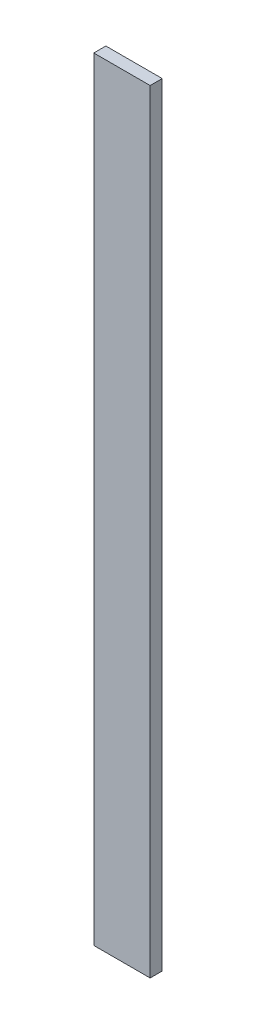
ISO-10303-21;
HEADER;
FILE_DESCRIPTION(('STEP AP214'),'2;1');
FILE_NAME('part.step','',(''),(''),'','','');
FILE_SCHEMA(('AUTOMOTIVE_DESIGN { 1 0 10303 214 1 1 1 1 }'));
ENDSEC;
DATA;
#1=APPLICATION_CONTEXT('core data for automotive mechanical design processes');
#2=APPLICATION_PROTOCOL_DEFINITION('international standard','automotive_design',2000,#1);
#3=PRODUCT_CONTEXT('',#1,'mechanical');
#4=PRODUCT('Part','Part','',(#3));
#5=PRODUCT_RELATED_PRODUCT_CATEGORY('part','',(#4));
#6=PRODUCT_DEFINITION_FORMATION('','',#4);
#7=PRODUCT_DEFINITION_CONTEXT('part definition',#1,'design');
#8=PRODUCT_DEFINITION('design','',#6,#7);
#9=PRODUCT_DEFINITION_SHAPE('','',#8);
#10=(LENGTH_UNIT() NAMED_UNIT(*) SI_UNIT(.MILLI.,.METRE.));
#11=(NAMED_UNIT(*) PLANE_ANGLE_UNIT() SI_UNIT($,.RADIAN.));
#12=(NAMED_UNIT(*) SI_UNIT($,.STERADIAN.) SOLID_ANGLE_UNIT());
#13=UNCERTAINTY_MEASURE_WITH_UNIT(LENGTH_MEASURE(1.E-05),#10,'distance_accuracy_value','');
#14=(GEOMETRIC_REPRESENTATION_CONTEXT(3) GLOBAL_UNCERTAINTY_ASSIGNED_CONTEXT((#13)) GLOBAL_UNIT_ASSIGNED_CONTEXT((#10,
#11,#12)) REPRESENTATION_CONTEXT('',''));
#15=CARTESIAN_POINT('',(0.,0.,0.));
#16=DIRECTION('',(0.,0.,1.));
#17=DIRECTION('',(1.,0.,0.));
#18=AXIS2_PLACEMENT_3D('',#15,#16,#17);
#19=CARTESIAN_POINT('',(44.45,1219.2,9.525));
#20=DIRECTION('',(-1.,0.,0.));
#21=DIRECTION('',(0.,0.,1.));
#22=AXIS2_PLACEMENT_3D('',#19,#20,#21);
#23=PLANE('',#22);
#24=DIRECTION('',(0.,0.,-1.));
#25=VECTOR('',#24,1.);
#26=CARTESIAN_POINT('',(44.45,0.,9.525));
#27=LINE('',#26,#25);
#28=CARTESIAN_POINT('',(44.45,0.,9.525));
#29=VERTEX_POINT('',#28);
#30=CARTESIAN_POINT('',(44.45,0.,-9.525));
#31=VERTEX_POINT('',#30);
#32=EDGE_CURVE('E104',#29,#31,#27,.T.);
#33=ORIENTED_EDGE('',*,*,#32,.T.);
#34=DIRECTION('',(0.,-1.,0.));
#35=VECTOR('',#34,1.);
#36=CARTESIAN_POINT('',(44.45,1219.2,-9.525));
#37=LINE('',#36,#35);
#38=CARTESIAN_POINT('',(44.45,1219.2,-9.525));
#39=VERTEX_POINT('',#38);
#40=EDGE_CURVE('E11',#39,#31,#37,.T.);
#41=ORIENTED_EDGE('',*,*,#40,.F.);
#42=DIRECTION('',(0.,0.,-1.));
#43=VECTOR('',#42,1.);
#44=CARTESIAN_POINT('',(44.45,1219.2,9.525));
#45=LINE('',#44,#43);
#46=CARTESIAN_POINT('',(44.45,1219.2,9.525));
#47=VERTEX_POINT('',#46);
#48=EDGE_CURVE('E92',#47,#39,#45,.T.);
#49=ORIENTED_EDGE('',*,*,#48,.F.);
#50=DIRECTION('',(0.,-1.,0.));
#51=VECTOR('',#50,1.);
#52=CARTESIAN_POINT('',(44.45,1219.2,9.525));
#53=LINE('',#52,#51);
#54=EDGE_CURVE('E100',#47,#29,#53,.T.);
#55=ORIENTED_EDGE('',*,*,#54,.T.);
#56=EDGE_LOOP('',(#33,#41,#49,#55));
#57=FACE_BOUND('',#56,.T.);
#58=ADVANCED_FACE('F41',(#57),#23,.F.);
#59=CARTESIAN_POINT('',(-44.45,1219.2,-9.525));
#60=DIRECTION('',(0.,0.,1.));
#61=DIRECTION('',(1.,0.,0.));
#62=AXIS2_PLACEMENT_3D('',#59,#60,#61);
#63=PLANE('',#62);
#64=DIRECTION('',(-1.,0.,0.));
#65=VECTOR('',#64,1.);
#66=CARTESIAN_POINT('',(-44.45,0.,-9.525));
#67=LINE('',#66,#65);
#68=CARTESIAN_POINT('',(-44.45,0.,-9.525));
#69=VERTEX_POINT('',#68);
#70=EDGE_CURVE('E96',#31,#69,#67,.T.);
#71=ORIENTED_EDGE('',*,*,#70,.T.);
#72=DIRECTION('',(0.,-1.,0.));
#73=VECTOR('',#72,1.);
#74=CARTESIAN_POINT('',(-44.45,1219.2,-9.525));
#75=LINE('',#74,#73);
#76=CARTESIAN_POINT('',(-44.45,1219.2,-9.525));
#77=VERTEX_POINT('',#76);
#78=EDGE_CURVE('E49',#77,#69,#75,.T.);
#79=ORIENTED_EDGE('',*,*,#78,.F.);
#80=DIRECTION('',(-1.,0.,0.));
#81=VECTOR('',#80,1.);
#82=CARTESIAN_POINT('',(-44.45,1219.2,-9.525));
#83=LINE('',#82,#81);
#84=EDGE_CURVE('E87',#39,#77,#83,.T.);
#85=ORIENTED_EDGE('',*,*,#84,.F.);
#86=ORIENTED_EDGE('',*,*,#40,.T.);
#87=EDGE_LOOP('',(#71,#79,#85,#86));
#88=FACE_BOUND('',#87,.T.);
#89=ADVANCED_FACE('F95',(#88),#63,.F.);
#90=CARTESIAN_POINT('',(-44.45,1219.2,9.525));
#91=DIRECTION('',(1.,0.,0.));
#92=DIRECTION('',(0.,0.,-1.));
#93=AXIS2_PLACEMENT_3D('',#90,#91,#92);
#94=PLANE('',#93);
#95=DIRECTION('',(0.,0.,1.));
#96=VECTOR('',#95,1.);
#97=CARTESIAN_POINT('',(-44.45,0.,9.525));
#98=LINE('',#97,#96);
#99=CARTESIAN_POINT('',(-44.45,0.,9.525));
#100=VERTEX_POINT('',#99);
#101=EDGE_CURVE('E74',#69,#100,#98,.T.);
#102=ORIENTED_EDGE('',*,*,#101,.T.);
#103=DIRECTION('',(0.,-1.,0.));
#104=VECTOR('',#103,1.);
#105=CARTESIAN_POINT('',(-44.45,1219.2,9.525));
#106=LINE('',#105,#104);
#107=CARTESIAN_POINT('',(-44.45,1219.2,9.525));
#108=VERTEX_POINT('',#107);
#109=EDGE_CURVE('E97',#108,#100,#106,.T.);
#110=ORIENTED_EDGE('',*,*,#109,.F.);
#111=DIRECTION('',(0.,0.,1.));
#112=VECTOR('',#111,1.);
#113=CARTESIAN_POINT('',(-44.45,1219.2,9.525));
#114=LINE('',#113,#112);
#115=EDGE_CURVE('E90',#77,#108,#114,.T.);
#116=ORIENTED_EDGE('',*,*,#115,.F.);
#117=ORIENTED_EDGE('',*,*,#78,.T.);
#118=EDGE_LOOP('',(#102,#110,#116,#117));
#119=FACE_BOUND('',#118,.T.);
#120=ADVANCED_FACE('F98',(#119),#94,.F.);
#121=CARTESIAN_POINT('',(-44.45,1219.2,9.525));
#122=DIRECTION('',(0.,0.,-1.));
#123=DIRECTION('',(-1.,0.,0.));
#124=AXIS2_PLACEMENT_3D('',#121,#122,#123);
#125=PLANE('',#124);
#126=DIRECTION('',(1.,0.,0.));
#127=VECTOR('',#126,1.);
#128=CARTESIAN_POINT('',(-44.45,0.,9.525));
#129=LINE('',#128,#127);
#130=EDGE_CURVE('E80',#100,#29,#129,.T.);
#131=ORIENTED_EDGE('',*,*,#130,.T.);
#132=ORIENTED_EDGE('',*,*,#54,.F.);
#133=DIRECTION('',(1.,0.,0.));
#134=VECTOR('',#133,1.);
#135=CARTESIAN_POINT('',(-44.45,1219.2,9.525));
#136=LINE('',#135,#134);
#137=EDGE_CURVE('E57',#108,#47,#136,.T.);
#138=ORIENTED_EDGE('',*,*,#137,.F.);
#139=ORIENTED_EDGE('',*,*,#109,.T.);
#140=EDGE_LOOP('',(#131,#132,#138,#139));
#141=FACE_BOUND('',#140,.T.);
#142=ADVANCED_FACE('F111',(#141),#125,.F.);
#143=CARTESIAN_POINT('',(0.,1219.2,0.));
#144=DIRECTION('',(0.,-1.,0.));
#145=DIRECTION('',(0.,0.,-1.));
#146=AXIS2_PLACEMENT_3D('',#143,#144,#145);
#147=PLANE('',#146);
#148=ORIENTED_EDGE('',*,*,#48,.T.);
#149=ORIENTED_EDGE('',*,*,#84,.T.);
#150=ORIENTED_EDGE('',*,*,#115,.T.);
#151=ORIENTED_EDGE('',*,*,#137,.T.);
#152=EDGE_LOOP('',(#148,#149,#150,#151));
#153=FACE_BOUND('',#152,.T.);
#154=ADVANCED_FACE('F88',(#153),#147,.F.);
#155=CARTESIAN_POINT('',(0.,0.,0.));
#156=DIRECTION('',(0.,-1.,0.));
#157=DIRECTION('',(0.,0.,-1.));
#158=AXIS2_PLACEMENT_3D('',#155,#156,#157);
#159=PLANE('',#158);
#160=ORIENTED_EDGE('',*,*,#32,.F.);
#161=ORIENTED_EDGE('',*,*,#130,.F.);
#162=ORIENTED_EDGE('',*,*,#101,.F.);
#163=ORIENTED_EDGE('',*,*,#70,.F.);
#164=EDGE_LOOP('',(#160,#161,#162,#163));
#165=FACE_BOUND('',#164,.T.);
#166=ADVANCED_FACE('F114',(#165),#159,.T.);
#167=CLOSED_SHELL('',(#58,#89,#120,#142,#154,#166));
#168=MANIFOLD_SOLID_BREP('B2',#167);
#169=ADVANCED_BREP_SHAPE_REPRESENTATION('',(#18,#168),#14);
#170=SHAPE_DEFINITION_REPRESENTATION(#9,#169);
ENDSEC;
END-ISO-10303-21;
